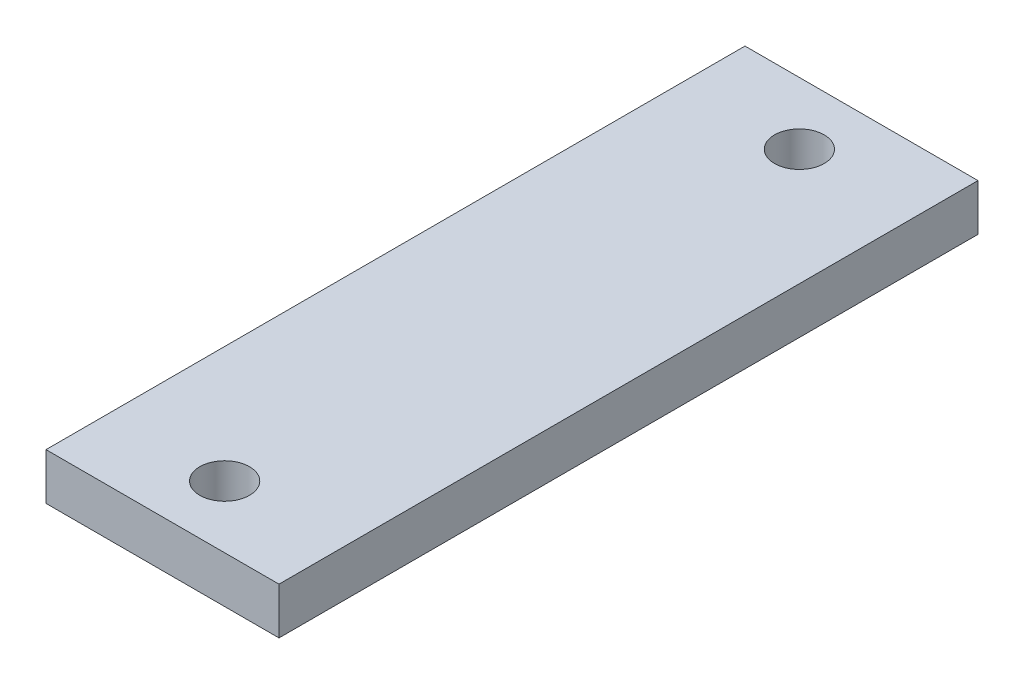
ISO-10303-21;
HEADER;
FILE_DESCRIPTION(('STEP AP214'),'2;1');
FILE_NAME('part.step','',(''),(''),'','','');
FILE_SCHEMA(('AUTOMOTIVE_DESIGN { 1 0 10303 214 1 1 1 1 }'));
ENDSEC;
DATA;
#1=APPLICATION_CONTEXT('core data for automotive mechanical design processes');
#2=APPLICATION_PROTOCOL_DEFINITION('international standard','automotive_design',2000,#1);
#3=PRODUCT_CONTEXT('',#1,'mechanical');
#4=PRODUCT('Part','Part','',(#3));
#5=PRODUCT_RELATED_PRODUCT_CATEGORY('part','',(#4));
#6=PRODUCT_DEFINITION_FORMATION('','',#4);
#7=PRODUCT_DEFINITION_CONTEXT('part definition',#1,'design');
#8=PRODUCT_DEFINITION('design','',#6,#7);
#9=PRODUCT_DEFINITION_SHAPE('','',#8);
#10=(LENGTH_UNIT() NAMED_UNIT(*) SI_UNIT(.MILLI.,.METRE.));
#11=(NAMED_UNIT(*) PLANE_ANGLE_UNIT() SI_UNIT($,.RADIAN.));
#12=(NAMED_UNIT(*) SI_UNIT($,.STERADIAN.) SOLID_ANGLE_UNIT());
#13=UNCERTAINTY_MEASURE_WITH_UNIT(LENGTH_MEASURE(1.E-05),#10,'distance_accuracy_value','');
#14=(GEOMETRIC_REPRESENTATION_CONTEXT(3) GLOBAL_UNCERTAINTY_ASSIGNED_CONTEXT((#13)) GLOBAL_UNIT_ASSIGNED_CONTEXT((#10,
#11,#12)) REPRESENTATION_CONTEXT('',''));
#15=CARTESIAN_POINT('',(0.,0.,0.));
#16=DIRECTION('',(0.,0.,1.));
#17=DIRECTION('',(1.,0.,0.));
#18=AXIS2_PLACEMENT_3D('',#15,#16,#17);
#19=CARTESIAN_POINT('',(0.,3.,0.));
#20=DIRECTION('',(0.,0.,-1.));
#21=DIRECTION('',(-1.,0.,0.));
#22=AXIS2_PLACEMENT_3D('',#19,#20,#21);
#23=PLANE('',#22);
#24=DIRECTION('',(1.,0.,0.));
#25=VECTOR('',#24,1.);
#26=CARTESIAN_POINT('',(0.,0.,0.));
#27=LINE('',#26,#25);
#28=CARTESIAN_POINT('',(0.,0.,0.));
#29=VERTEX_POINT('',#28);
#30=CARTESIAN_POINT('',(15.,0.,0.));
#31=VERTEX_POINT('',#30);
#32=EDGE_CURVE('E98',#29,#31,#27,.T.);
#33=ORIENTED_EDGE('',*,*,#32,.T.);
#34=DIRECTION('',(0.,-1.,0.));
#35=VECTOR('',#34,1.);
#36=CARTESIAN_POINT('',(15.,3.,0.));
#37=LINE('',#36,#35);
#38=CARTESIAN_POINT('',(15.,3.,0.));
#39=VERTEX_POINT('',#38);
#40=EDGE_CURVE('E11',#39,#31,#37,.T.);
#41=ORIENTED_EDGE('',*,*,#40,.F.);
#42=DIRECTION('',(1.,0.,0.));
#43=VECTOR('',#42,1.);
#44=CARTESIAN_POINT('',(0.,3.,0.));
#45=LINE('',#44,#43);
#46=CARTESIAN_POINT('',(0.,3.,0.));
#47=VERTEX_POINT('',#46);
#48=EDGE_CURVE('E84',#47,#39,#45,.T.);
#49=ORIENTED_EDGE('',*,*,#48,.F.);
#50=DIRECTION('',(0.,-1.,0.));
#51=VECTOR('',#50,1.);
#52=CARTESIAN_POINT('',(0.,3.,0.));
#53=LINE('',#52,#51);
#54=EDGE_CURVE('E51',#47,#29,#53,.T.);
#55=ORIENTED_EDGE('',*,*,#54,.T.);
#56=EDGE_LOOP('',(#33,#41,#49,#55));
#57=FACE_BOUND('',#56,.T.);
#58=ADVANCED_FACE('F35',(#57),#23,.F.);
#59=CARTESIAN_POINT('',(15.,3.,0.));
#60=DIRECTION('',(-1.,0.,0.));
#61=DIRECTION('',(0.,0.,1.));
#62=AXIS2_PLACEMENT_3D('',#59,#60,#61);
#63=PLANE('',#62);
#64=DIRECTION('',(0.,0.,-1.));
#65=VECTOR('',#64,1.);
#66=CARTESIAN_POINT('',(15.,0.,0.));
#67=LINE('',#66,#65);
#68=CARTESIAN_POINT('',(15.,0.,-45.));
#69=VERTEX_POINT('',#68);
#70=EDGE_CURVE('E89',#31,#69,#67,.T.);
#71=ORIENTED_EDGE('',*,*,#70,.T.);
#72=DIRECTION('',(0.,-1.,0.));
#73=VECTOR('',#72,1.);
#74=CARTESIAN_POINT('',(15.,3.,-45.));
#75=LINE('',#74,#73);
#76=CARTESIAN_POINT('',(15.,3.,-45.));
#77=VERTEX_POINT('',#76);
#78=EDGE_CURVE('E43',#77,#69,#75,.T.);
#79=ORIENTED_EDGE('',*,*,#78,.F.);
#80=DIRECTION('',(0.,0.,-1.));
#81=VECTOR('',#80,1.);
#82=CARTESIAN_POINT('',(15.,3.,0.));
#83=LINE('',#82,#81);
#84=EDGE_CURVE('E76',#39,#77,#83,.T.);
#85=ORIENTED_EDGE('',*,*,#84,.F.);
#86=ORIENTED_EDGE('',*,*,#40,.T.);
#87=EDGE_LOOP('',(#71,#79,#85,#86));
#88=FACE_BOUND('',#87,.T.);
#89=ADVANCED_FACE('F88',(#88),#63,.F.);
#90=CARTESIAN_POINT('',(0.,3.,-45.));
#91=DIRECTION('',(0.,0.,-1.));
#92=DIRECTION('',(-1.,0.,0.));
#93=AXIS2_PLACEMENT_3D('',#90,#91,#92);
#94=PLANE('',#93);
#95=DIRECTION('',(1.,0.,0.));
#96=VECTOR('',#95,1.);
#97=CARTESIAN_POINT('',(0.,0.,-45.));
#98=LINE('',#97,#96);
#99=CARTESIAN_POINT('',(0.,0.,-45.));
#100=VERTEX_POINT('',#99);
#101=EDGE_CURVE('E102',#100,#69,#98,.T.);
#102=ORIENTED_EDGE('',*,*,#101,.F.);
#103=DIRECTION('',(0.,-1.,0.));
#104=VECTOR('',#103,1.);
#105=CARTESIAN_POINT('',(0.,3.,-45.));
#106=LINE('',#105,#104);
#107=CARTESIAN_POINT('',(0.,3.,-45.));
#108=VERTEX_POINT('',#107);
#109=EDGE_CURVE('E65',#108,#100,#106,.T.);
#110=ORIENTED_EDGE('',*,*,#109,.F.);
#111=DIRECTION('',(1.,0.,0.));
#112=VECTOR('',#111,1.);
#113=CARTESIAN_POINT('',(0.,3.,-45.));
#114=LINE('',#113,#112);
#115=EDGE_CURVE('E83',#108,#77,#114,.T.);
#116=ORIENTED_EDGE('',*,*,#115,.T.);
#117=ORIENTED_EDGE('',*,*,#78,.T.);
#118=EDGE_LOOP('',(#102,#110,#116,#117));
#119=FACE_BOUND('',#118,.T.);
#120=ADVANCED_FACE('F92',(#119),#94,.T.);
#121=CARTESIAN_POINT('',(0.,3.,0.));
#122=DIRECTION('',(-1.,0.,0.));
#123=DIRECTION('',(0.,0.,1.));
#124=AXIS2_PLACEMENT_3D('',#121,#122,#123);
#125=PLANE('',#124);
#126=DIRECTION('',(0.,0.,-1.));
#127=VECTOR('',#126,1.);
#128=CARTESIAN_POINT('',(0.,0.,0.));
#129=LINE('',#128,#127);
#130=EDGE_CURVE('E104',#29,#100,#129,.T.);
#131=ORIENTED_EDGE('',*,*,#130,.F.);
#132=ORIENTED_EDGE('',*,*,#54,.F.);
#133=DIRECTION('',(0.,0.,-1.));
#134=VECTOR('',#133,1.);
#135=CARTESIAN_POINT('',(0.,3.,0.));
#136=LINE('',#135,#134);
#137=EDGE_CURVE('E93',#47,#108,#136,.T.);
#138=ORIENTED_EDGE('',*,*,#137,.T.);
#139=ORIENTED_EDGE('',*,*,#109,.T.);
#140=EDGE_LOOP('',(#131,#132,#138,#139));
#141=FACE_BOUND('',#140,.T.);
#142=ADVANCED_FACE('F134',(#141),#125,.T.);
#143=CARTESIAN_POINT('',(0.,3.,0.));
#144=DIRECTION('',(0.,1.,0.));
#145=DIRECTION('',(0.,0.,1.));
#146=AXIS2_PLACEMENT_3D('',#143,#144,#145);
#147=PLANE('',#146);
#148=CARTESIAN_POINT('',(7.50000000000013,3.,-3.99999999999996));
#149=DIRECTION('',(0.,1.,0.));
#150=DIRECTION('',(0.,0.,1.));
#151=AXIS2_PLACEMENT_3D('',#148,#149,#150);
#152=CIRCLE('',#151,1.6);
#153=CARTESIAN_POINT('',(7.50000000000013,3.,-2.39999999999996));
#154=VERTEX_POINT('',#153);
#155=EDGE_CURVE('E116',#154,#154,#152,.T.);
#156=ORIENTED_EDGE('',*,*,#155,.F.);
#157=EDGE_LOOP('',(#156));
#158=FACE_BOUND('',#157,.T.);
#159=CARTESIAN_POINT('',(7.50000000000003,3.,-41.));
#160=DIRECTION('',(0.,1.,0.));
#161=DIRECTION('',(0.,0.,1.));
#162=AXIS2_PLACEMENT_3D('',#159,#160,#161);
#163=CIRCLE('',#162,1.59999999999998);
#164=CARTESIAN_POINT('',(7.50000000000003,3.,-39.4));
#165=VERTEX_POINT('',#164);
#166=EDGE_CURVE('E110',#165,#165,#163,.T.);
#167=ORIENTED_EDGE('',*,*,#166,.F.);
#168=EDGE_LOOP('',(#167));
#169=FACE_BOUND('',#168,.T.);
#170=ORIENTED_EDGE('',*,*,#48,.T.);
#171=ORIENTED_EDGE('',*,*,#84,.T.);
#172=ORIENTED_EDGE('',*,*,#115,.F.);
#173=ORIENTED_EDGE('',*,*,#137,.F.);
#174=EDGE_LOOP('',(#170,#171,#172,#173));
#175=FACE_BOUND('',#174,.T.);
#176=ADVANCED_FACE('F80',(#158,#169,#175),#147,.T.);
#177=CARTESIAN_POINT('',(0.,0.,0.));
#178=DIRECTION('',(0.,1.,0.));
#179=DIRECTION('',(0.,0.,1.));
#180=AXIS2_PLACEMENT_3D('',#177,#178,#179);
#181=PLANE('',#180);
#182=CARTESIAN_POINT('',(7.50000000000013,0.,-3.99999999999996));
#183=DIRECTION('',(0.,1.,0.));
#184=DIRECTION('',(0.,0.,1.));
#185=AXIS2_PLACEMENT_3D('',#182,#183,#184);
#186=CIRCLE('',#185,1.6);
#187=CARTESIAN_POINT('',(7.50000000000013,0.,-2.39999999999996));
#188=VERTEX_POINT('',#187);
#189=EDGE_CURVE('E100',#188,#188,#186,.T.);
#190=ORIENTED_EDGE('',*,*,#189,.T.);
#191=EDGE_LOOP('',(#190));
#192=FACE_BOUND('',#191,.T.);
#193=CARTESIAN_POINT('',(7.50000000000003,0.,-41.));
#194=DIRECTION('',(0.,1.,0.));
#195=DIRECTION('',(0.,0.,1.));
#196=AXIS2_PLACEMENT_3D('',#193,#194,#195);
#197=CIRCLE('',#196,1.59999999999998);
#198=CARTESIAN_POINT('',(7.50000000000003,0.,-39.4));
#199=VERTEX_POINT('',#198);
#200=EDGE_CURVE('E113',#199,#199,#197,.T.);
#201=ORIENTED_EDGE('',*,*,#200,.T.);
#202=EDGE_LOOP('',(#201));
#203=FACE_BOUND('',#202,.T.);
#204=ORIENTED_EDGE('',*,*,#32,.F.);
#205=ORIENTED_EDGE('',*,*,#130,.T.);
#206=ORIENTED_EDGE('',*,*,#101,.T.);
#207=ORIENTED_EDGE('',*,*,#70,.F.);
#208=EDGE_LOOP('',(#204,#205,#206,#207));
#209=FACE_BOUND('',#208,.T.);
#210=ADVANCED_FACE('F122',(#192,#203,#209),#181,.F.);
#211=CARTESIAN_POINT('',(7.50000000000003,0.,-41.));
#212=DIRECTION('',(0.,1.,0.));
#213=DIRECTION('',(0.,0.,1.));
#214=AXIS2_PLACEMENT_3D('',#211,#212,#213);
#215=CYLINDRICAL_SURFACE('',#214,1.59999999999998);
#216=ORIENTED_EDGE('',*,*,#200,.F.);
#217=EDGE_LOOP('',(#216));
#218=FACE_BOUND('',#217,.T.);
#219=ORIENTED_EDGE('',*,*,#166,.T.);
#220=EDGE_LOOP('',(#219));
#221=FACE_BOUND('',#220,.T.);
#222=ADVANCED_FACE('F128',(#218,#221),#215,.F.);
#223=CARTESIAN_POINT('',(7.50000000000013,0.,-3.99999999999996));
#224=DIRECTION('',(0.,1.,0.));
#225=DIRECTION('',(0.,0.,1.));
#226=AXIS2_PLACEMENT_3D('',#223,#224,#225);
#227=CYLINDRICAL_SURFACE('',#226,1.6);
#228=ORIENTED_EDGE('',*,*,#189,.F.);
#229=EDGE_LOOP('',(#228));
#230=FACE_BOUND('',#229,.T.);
#231=ORIENTED_EDGE('',*,*,#155,.T.);
#232=EDGE_LOOP('',(#231));
#233=FACE_BOUND('',#232,.T.);
#234=ADVANCED_FACE('F125',(#230,#233),#227,.F.);
#235=CLOSED_SHELL('',(#58,#89,#120,#142,#176,#210,#222,#234));
#236=MANIFOLD_SOLID_BREP('B2',#235);
#237=ADVANCED_BREP_SHAPE_REPRESENTATION('',(#18,#236),#14);
#238=SHAPE_DEFINITION_REPRESENTATION(#9,#237);
ENDSEC;
END-ISO-10303-21;
